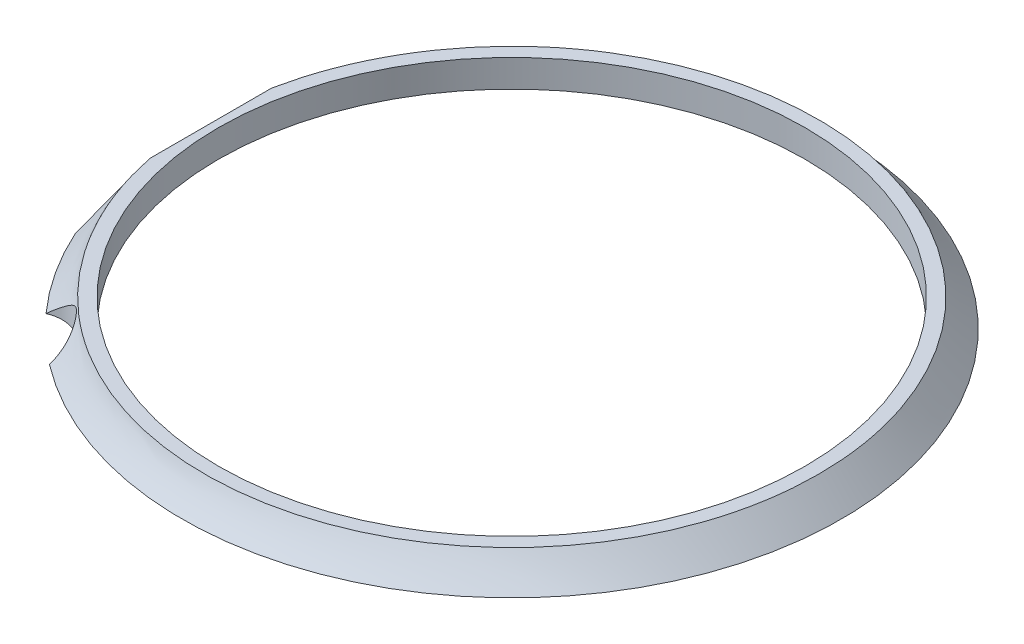
ISO-10303-21;
HEADER;
FILE_DESCRIPTION(('STEP AP214'),'2;1');
FILE_NAME('part.step','',(''),(''),'','','');
FILE_SCHEMA(('AUTOMOTIVE_DESIGN { 1 0 10303 214 1 1 1 1 }'));
ENDSEC;
DATA;
#1=APPLICATION_CONTEXT('core data for automotive mechanical design processes');
#2=APPLICATION_PROTOCOL_DEFINITION('international standard','automotive_design',2000,#1);
#3=PRODUCT_CONTEXT('',#1,'mechanical');
#4=PRODUCT('Part','Part','',(#3));
#5=PRODUCT_RELATED_PRODUCT_CATEGORY('part','',(#4));
#6=PRODUCT_DEFINITION_FORMATION('','',#4);
#7=PRODUCT_DEFINITION_CONTEXT('part definition',#1,'design');
#8=PRODUCT_DEFINITION('design','',#6,#7);
#9=PRODUCT_DEFINITION_SHAPE('','',#8);
#10=(LENGTH_UNIT() NAMED_UNIT(*) SI_UNIT(.MILLI.,.METRE.));
#11=(NAMED_UNIT(*) PLANE_ANGLE_UNIT() SI_UNIT($,.RADIAN.));
#12=(NAMED_UNIT(*) SI_UNIT($,.STERADIAN.) SOLID_ANGLE_UNIT());
#13=UNCERTAINTY_MEASURE_WITH_UNIT(LENGTH_MEASURE(1.E-05),#10,'distance_accuracy_value','');
#14=(GEOMETRIC_REPRESENTATION_CONTEXT(3) GLOBAL_UNCERTAINTY_ASSIGNED_CONTEXT((#13)) GLOBAL_UNIT_ASSIGNED_CONTEXT((#10,
#11,#12)) REPRESENTATION_CONTEXT('',''));
#15=CARTESIAN_POINT('',(0.,0.,0.));
#16=DIRECTION('',(0.,0.,1.));
#17=DIRECTION('',(1.,0.,0.));
#18=AXIS2_PLACEMENT_3D('',#15,#16,#17);
#19=CARTESIAN_POINT('',(-41.8249999995088,0.,18.7780931950262));
#20=CARTESIAN_POINT('',(-41.8249999995088,3.81,8.45984391351797));
#21=CARTESIAN_POINT('',(-15.9429608577891,0.,76.4259212171197));
#22=CARTESIAN_POINT('',(-27.7865568512575,3.81,77.8651297167816));
#23=CARTESIAN_POINT('',(45.847,0.,63.1913920229519));
#24=CARTESIAN_POINT('',(42.672,3.81,70.8108154412826));
#25=CARTESIAN_POINT('',(45.847,0.,-63.1913920229519));
#26=CARTESIAN_POINT('',(42.672,3.81,-70.8108154412826));
#27=CARTESIAN_POINT('',(-15.9429608577891,0.,-76.4259212171198));
#28=CARTESIAN_POINT('',(-27.7865568512574,3.81,-77.8651297167816));
#29=CARTESIAN_POINT('',(-41.8249999995088,0.,-18.7780931950262));
#30=CARTESIAN_POINT('',(-41.8249999995088,3.81,-8.45984391351802));
#31=(BOUNDED_SURFACE() B_SPLINE_SURFACE(3,1,((#19,#20),(#21,#22),(#23,#24),(#25,#26),(#27,#28),
(#29,#30)),.UNSPECIFIED.,.F.,.F.,.F.) B_SPLINE_SURFACE_WITH_KNOTS((4,2,4),(2,2),(0.,0.5,1.),(0.,
1.),.UNSPECIFIED.) GEOMETRIC_REPRESENTATION_ITEM() RATIONAL_B_SPLINE_SURFACE(((1.,1.),
(0.22368840777683,0.159798457629938),(0.105795018124039,0.0638791126665803),(0.105795018124039,
0.0638791126665803),(0.22368840777683,0.159798457629938),(1.,1.))) REPRESENTATION_ITEM('') SURFACE());
#32=CARTESIAN_POINT('',(0.,0.,0.));
#33=DIRECTION('',(0.,1.,0.));
#34=DIRECTION('',(0.,0.,1.));
#35=AXIS2_PLACEMENT_3D('',#32,#33,#34);
#36=CIRCLE('',#35,45.847);
#37=CARTESIAN_POINT('',(-41.8249999995088,0.,18.7780931950262));
#38=VERTEX_POINT('',#37);
#39=CARTESIAN_POINT('',(-34.1756288872835,1.3317228245493E-13,30.5609849180038));
#40=VERTEX_POINT('',#39);
#41=EDGE_CURVE('E104',#38,#40,#36,.T.);
#42=CARTESIAN_POINT('',(-34.1756288872835,4.78382521952232E-12,30.5609849180038));
#43=CARTESIAN_POINT('',(-34.0790516877042,0.0824546529163062,30.5194759500783));
#44=CARTESIAN_POINT('',(-33.9811988656631,0.165049547194292,30.4812178664513));
#45=CARTESIAN_POINT('',(-33.7832628001081,0.330405720716436,30.4112914406965));
#46=CARTESIAN_POINT('',(-33.6831790527442,0.413167033626343,30.3796246042296));
#47=CARTESIAN_POINT('',(-33.4811349348423,0.578713547170543,30.3229844774318));
#48=CARTESIAN_POINT('',(-33.3791743535553,0.661498749447283,30.298011943762));
#49=CARTESIAN_POINT('',(-33.1729364269723,0.8275803363406,30.2546906722965));
#50=CARTESIAN_POINT('',(-33.0686472971881,0.910875758263926,30.2363943307135));
#51=CARTESIAN_POINT('',(-32.8588686000301,1.07717809116038,30.2067899687014));
#52=CARTESIAN_POINT('',(-32.7533791537151,1.16018503014545,30.1954812497822));
#53=CARTESIAN_POINT('',(-32.5415418044431,1.32572471170788,30.1799439099838));
#54=CARTESIAN_POINT('',(-32.4351940307537,1.40825752260027,30.1757142422511));
#55=CARTESIAN_POINT('',(-32.1838532712099,1.60201619305894,30.1742030489647));
#56=CARTESIAN_POINT('',(-32.0386173557935,1.71296715727747,30.1799409417553));
#57=CARTESIAN_POINT('',(-31.7478109539478,1.93295371792707,30.2049344329739));
#58=CARTESIAN_POINT('',(-31.6022403950101,2.04198884398452,30.2241933048001));
#59=CARTESIAN_POINT('',(-31.3118823489997,2.25668156594579,30.2765663387532));
#60=CARTESIAN_POINT('',(-31.1670939550443,2.36235014514909,30.3096290862594));
#61=CARTESIAN_POINT('',(-30.9504405327218,2.51718118055771,30.3701215173245));
#62=CARTESIAN_POINT('',(-30.87832597975,2.56816925091541,30.3920962989179));
#63=CARTESIAN_POINT('',(-30.7342569872871,2.66857135573627,30.4398218805117));
#64=CARTESIAN_POINT('',(-30.6623025216772,2.71798566764545,30.4655720104008));
#65=CARTESIAN_POINT('',(-30.5302881122611,2.80684662294673,30.5164985234848));
#66=CARTESIAN_POINT('',(-30.4702067695359,2.84660210387898,30.5410804560938));
#67=CARTESIAN_POINT('',(-30.3501294187899,2.924276705525,30.5931530087955));
#68=CARTESIAN_POINT('',(-30.2901333971589,2.96219616113305,30.6206430955));
#69=CARTESIAN_POINT('',(-30.1701284438456,3.0357226247667,30.6787426358889));
#70=CARTESIAN_POINT('',(-30.1101195478741,3.07132755286394,30.7093548334731));
#71=CARTESIAN_POINT('',(-29.9901554926618,3.13946660637709,30.7738714572537));
#72=CARTESIAN_POINT('',(-29.9302003292669,3.17200099396896,30.807775601867));
#73=CARTESIAN_POINT('',(-29.7690753520476,3.25412468076235,30.9036988171271));
#74=CARTESIAN_POINT('',(-29.6678769235556,3.30008295669539,30.9690361292844));
#75=CARTESIAN_POINT('',(-29.5171193004197,3.35586827544754,31.0750731654993));
#76=CARTESIAN_POINT('',(-29.4671034304848,3.37225876523768,31.1117053719498));
#77=CARTESIAN_POINT('',(-29.3676510162733,3.39982809815378,31.1876437236439));
#78=CARTESIAN_POINT('',(-29.31821427987,3.41100872029103,31.2269489508709));
#79=CARTESIAN_POINT('',(-29.2288082781275,3.42601344077296,31.301032427126));
#80=CARTESIAN_POINT('',(-29.1886751026885,3.43077300335648,31.3354241753082));
#81=CARTESIAN_POINT('',(-29.1094277980812,3.43597073456687,31.4056760665071));
#82=CARTESIAN_POINT('',(-29.0703135355323,3.43640947167423,31.4415360157327));
#83=CARTESIAN_POINT('',(-28.9934066064559,3.43292727079906,31.5144522732109));
#84=CARTESIAN_POINT('',(-28.9556141724136,3.42900556983361,31.5515087897353));
#85=CARTESIAN_POINT('',(-28.8816134884635,3.41699294299171,31.6265161793839));
#86=CARTESIAN_POINT('',(-28.8454055104814,3.40890130448781,31.6644672043183));
#87=CARTESIAN_POINT('',(-28.7640420253439,3.38588292622182,31.7525900340755));
#88=CARTESIAN_POINT('',(-28.7194991596746,3.36962810670546,31.8029808838595));
#89=CARTESIAN_POINT('',(-28.6335272005109,3.33168863558407,31.9044067577392));
#90=CARTESIAN_POINT('',(-28.5921010072358,3.30999900592839,31.9554423314529));
#91=CARTESIAN_POINT('',(-28.5121946291211,3.2621730103,32.058059228101));
#92=CARTESIAN_POINT('',(-28.4737261062896,3.23602023209365,32.1096418814996));
#93=CARTESIAN_POINT('',(-28.3997680653215,3.18026120304879,32.2130269548802));
#94=CARTESIAN_POINT('',(-28.3642778944715,3.15065571229755,32.2648293240828));
#95=CARTESIAN_POINT('',(-28.264158633257,3.05979815731606,32.4172085125385));
#96=CARTESIAN_POINT('',(-28.2033276344961,2.99484897490993,32.5180810861097));
#97=CARTESIAN_POINT('',(-28.0908339065977,2.85866592162234,32.7207061831737));
#98=CARTESIAN_POINT('',(-28.039179496807,2.78742643474479,32.8224594183165));
#99=CARTESIAN_POINT('',(-27.9441870330087,2.6408193237885,33.0270616325258));
#100=CARTESIAN_POINT('',(-27.9008591209809,2.56544680729623,33.1299117888239));
#101=CARTESIAN_POINT('',(-27.8220680143391,2.41202543756798,33.3366358231647));
#102=CARTESIAN_POINT('',(-27.786606932381,2.3339758718859,33.4405099683987));
#103=CARTESIAN_POINT('',(-27.7060088432312,2.13321218024965,33.7059352370803));
#104=CARTESIAN_POINT('',(-27.6660822948473,2.00927030441305,33.8681609020256));
#105=CARTESIAN_POINT('',(-27.60359565078,1.75918151220183,34.1943320080754));
#106=CARTESIAN_POINT('',(-27.581044727405,1.63303346710888,34.3582783112566));
#107=CARTESIAN_POINT('',(-27.553128218866,1.37995763716617,34.6866382286432));
#108=CARTESIAN_POINT('',(-27.5477369915352,1.25303130000438,34.8510507777673));
#109=CARTESIAN_POINT('',(-27.5539780828322,0.999025205137314,35.1794326896382));
#110=CARTESIAN_POINT('',(-27.5656105398483,0.871945446193235,35.3434020487715));
#111=CARTESIAN_POINT('',(-27.6055613274528,0.620053344948124,35.6672644003016));
#112=CARTESIAN_POINT('',(-27.6336383006751,0.49523459496259,35.8271821412167));
#113=CARTESIAN_POINT('',(-27.7061304488373,0.246720512001005,36.1436688661883));
#114=CARTESIAN_POINT('',(-27.7505155548785,0.12302353810021,36.3002434556857));
#115=CARTESIAN_POINT('',(-27.8030299376046,0.,36.454614732413));
#116=B_SPLINE_CURVE_WITH_KNOTS('',3,(#42,#43,#44,#45,#46,#47,#48,#49,#50,#51,#52,#53,#54,#55,
#56,#57,#58,#59,#60,#61,#62,#63,#64,#65,#66,#67,#68,#69,#70,#71,#72,#73,#74,#75,#76,#77,#78,#79,
#80,#81,#82,#83,#84,#85,#86,#87,#88,#89,#90,#91,#92,#93,#94,#95,#96,#97,#98,#99,#100,#101,#102,
#103,#104,#105,#106,#107,#108,#109,#110,#111,#112,#113,#114,#115),.UNSPECIFIED.,.F.,.F.,(4,2,2,
2,2,2,2,2,2,2,2,2,2,2,2,2,2,2,2,2,2,2,2,2,2,2,2,2,2,2,2,2,2,2,2,2,4),(0.,0.400752067362811,
0.801595579642889,1.20248438041773,1.60645501177636,2.01038525527044,2.41425576008042,
2.96230255175026,3.51048207007455,4.05663777330799,4.32960122335883,4.60251628185416,
4.830813232307,5.05906838289588,5.28752589542609,5.51596388358928,5.90127698864556,
6.09344240598417,6.28554215650701,6.44455092863526,6.60353878008675,6.76255445537255,
6.92159731488568,7.12882434139867,7.33624187721116,7.54443926152934,7.75259089905345,
8.1554570199123,8.55868652927859,8.96240411650971,9.3662299921632,9.989456817406,
10.6130124089316,11.2356357670651,11.8582641866259,12.4719754595566,13.0845608053353),.UNSPECIFIED.);
#117=CARTESIAN_POINT('',(-27.8030299376114,0.,36.4546147324078));
#118=VERTEX_POINT('',#117);
#119=EDGE_CURVE('E11',#40,#118,#116,.T.);
#120=CARTESIAN_POINT('',(-27.8030299376099,1.33172282454928E-13,-36.4546147324059));
#121=VERTEX_POINT('',#120);
#122=EDGE_CURVE('E97',#118,#121,#36,.T.);
#123=CARTESIAN_POINT('',(-27.8030299376099,4.50376339441429E-12,-36.4546147324059));
#124=CARTESIAN_POINT('',(-27.7687467823755,0.0803296739678253,-36.353829428577));
#125=CARTESIAN_POINT('',(-27.7379243110401,0.160941931389481,-36.2520969173375));
#126=CARTESIAN_POINT('',(-27.6832304691349,0.322615444406957,-36.0471224377738));
#127=CARTESIAN_POINT('',(-27.6593594244016,0.403676720868381,-35.9438803989311));
#128=CARTESIAN_POINT('',(-27.618600156033,0.566129461167152,-35.7362750672095));
#129=CARTESIAN_POINT('',(-27.6017123545856,0.647520944667622,-35.6319117069297));
#130=CARTESIAN_POINT('',(-27.5747659516491,0.811556507141978,-35.4210759883172));
#131=CARTESIAN_POINT('',(-27.5647990853103,0.894203102619583,-35.3145938588799));
#132=CARTESIAN_POINT('',(-27.5520680736961,1.059531600838,-35.1012353206684));
#133=CARTESIAN_POINT('',(-27.5493035912117,1.14221350174457,-34.9943589305877));
#134=CARTESIAN_POINT('',(-27.5509928891297,1.30741915067271,-34.7805618555216));
#135=CARTESIAN_POINT('',(-27.5554458066548,1.38994291641924,-34.6736411773588));
#136=CARTESIAN_POINT('',(-27.5720220704635,1.55896152776035,-34.4544141487491));
#137=CARTESIAN_POINT('',(-27.5845379773484,1.64543599913601,-34.3421214928543));
#138=CARTESIAN_POINT('',(-27.6176626444916,1.81763580958423,-34.118116730928));
#139=CARTESIAN_POINT('',(-27.6382730986788,1.9033609880128,-34.0064047513746));
#140=CARTESIAN_POINT('',(-27.6877212793598,2.07363367849421,-33.7837591195434));
#141=CARTESIAN_POINT('',(-27.7165654192739,2.15818021842181,-33.6728261433363));
#142=CARTESIAN_POINT('',(-27.782499998266,2.32487022610439,-33.4526318437122));
#143=CARTESIAN_POINT('',(-27.8195429808314,2.40702456284356,-33.343364619444));
#144=CARTESIAN_POINT('',(-27.9023037312351,2.56834284317102,-33.1260190545079));
#145=CARTESIAN_POINT('',(-27.9480159181911,2.64750867154077,-33.0179399960452));
#146=CARTESIAN_POINT('',(-28.0486868528748,2.8012080961087,-32.8029804029682));
#147=CARTESIAN_POINT('',(-28.103632039419,2.87574826961305,-32.6960983523028));
#148=CARTESIAN_POINT('',(-28.193164983893,2.98138646268919,-32.537522786491));
#149=CARTESIAN_POINT('',(-28.223854793788,3.01526213028256,-32.4854665394211));
#150=CARTESIAN_POINT('',(-28.2878715298897,3.0807669952808,-32.3815541045416));
#151=CARTESIAN_POINT('',(-28.3211983403864,3.11239629113965,-32.3296979080586));
#152=CARTESIAN_POINT('',(-28.3906443231824,3.17276894197532,-32.2262257752145));
#153=CARTESIAN_POINT('',(-28.4267612243719,3.20151460129328,-32.1746096789565));
#154=CARTESIAN_POINT('',(-28.501962023801,3.2553487651953,-32.0716595102314));
#155=CARTESIAN_POINT('',(-28.5410454519637,3.28043784736966,-32.0203253944584));
#156=CARTESIAN_POINT('',(-28.6477839143823,3.34022802331255,-31.8860660174121));
#157=CARTESIAN_POINT('',(-28.7180572988829,3.37116632362161,-31.8034035884194));
#158=CARTESIAN_POINT('',(-28.8293454197878,3.40493775174718,-31.6815187132792));
#159=CARTESIAN_POINT('',(-28.8673832248822,3.41408624990685,-31.6412781487722));
#160=CARTESIAN_POINT('',(-28.9452665112728,3.42775928861925,-31.561751440322));
#161=CARTESIAN_POINT('',(-28.9851118633616,3.43228415913688,-31.522465228467));
#162=CARTESIAN_POINT('',(-29.0665249936773,3.43646914779562,-31.4449995178995));
#163=CARTESIAN_POINT('',(-29.1081009073009,3.43610287883115,-31.4068271365055));
#164=CARTESIAN_POINT('',(-29.1923991601175,3.43048230488662,-31.3321487791143));
#165=CARTESIAN_POINT('',(-29.235121536427,3.42522784146683,-31.2956428571718));
#166=CARTESIAN_POINT('',(-29.3214298723357,3.41013100592703,-31.2244797058149));
#167=CARTESIAN_POINT('',(-29.3650174588772,3.40027901020345,-31.1898265249813));
#168=CARTESIAN_POINT('',(-29.4526745394879,3.37648869794448,-31.1225810958056));
#169=CARTESIAN_POINT('',(-29.4967442320248,3.36254863247344,-31.0899897368107));
#170=CARTESIAN_POINT('',(-29.6063036547645,3.3236528551073,-31.0118112293184));
#171=CARTESIAN_POINT('',(-29.6719464047248,3.29661859738827,-30.9674731967203));
#172=CARTESIAN_POINT('',(-29.8034121771341,3.23670695517885,-30.8832481728738));
#173=CARTESIAN_POINT('',(-29.8692352869577,3.20382590877612,-30.8433639967633));
#174=CARTESIAN_POINT('',(-30.0011201167315,3.13359885800592,-30.7676504752641));
#175=CARTESIAN_POINT('',(-30.0671819615937,3.09623979552824,-30.7318336122444));
#176=CARTESIAN_POINT('',(-30.1993688329343,3.01823153760124,-30.6640756940901));
#177=CARTESIAN_POINT('',(-30.2654938739361,2.97758108353412,-30.6321361334036));
#178=CARTESIAN_POINT('',(-30.3965292459983,2.89462548019347,-30.5724731082852));
#179=CARTESIAN_POINT('',(-30.4614381114195,2.85236807484449,-30.544679556631));
#180=CARTESIAN_POINT('',(-30.5913671145861,2.76601807450166,-30.4923834177217));
#181=CARTESIAN_POINT('',(-30.6563872701676,2.72192515240131,-30.46788142037));
#182=CARTESIAN_POINT('',(-30.8517182967234,2.58747487431465,-30.3990548374002));
#183=CARTESIAN_POINT('',(-30.9822407178826,2.49498421332836,-30.3594362513989));
#184=CARTESIAN_POINT('',(-31.2437330253332,2.30647734872086,-30.291951418864));
#185=CARTESIAN_POINT('',(-31.3747029565831,2.21046078082918,-30.2640863903549));
#186=CARTESIAN_POINT('',(-31.6368283806868,2.01608198940844,-30.2196312447695));
#187=CARTESIAN_POINT('',(-31.7679838947019,1.91771947398036,-30.2030425384272));
#188=CARTESIAN_POINT('',(-32.0401248488646,1.71179762061938,-30.1799889879246));
#189=CARTESIAN_POINT('',(-32.1810905400286,1.60411276344494,-30.1744008509286));
#190=CARTESIAN_POINT('',(-32.4620489366487,1.38758652223469,-30.1756715793049));
#191=CARTESIAN_POINT('',(-32.6020414480718,1.2787449179198,-30.182532859223));
#192=CARTESIAN_POINT('',(-33.0190802166047,0.951506518537877,-30.2214591476529));
#193=CARTESIAN_POINT('',(-33.2938156588769,0.73192114713069,-30.2718158112191));
#194=CARTESIAN_POINT('',(-33.666403541452,0.427004926923235,-30.3744652979919));
#195=CARTESIAN_POINT('',(-33.7699818727807,0.341438988184464,-30.4068619030874));
#196=CARTESIAN_POINT('',(-33.9746872693336,0.170545287052974,-30.4786797444817));
#197=CARTESIAN_POINT('',(-34.0758166724699,0.0852173723434672,-30.5180939546282));
#198=CARTESIAN_POINT('',(-34.1756288872792,0.,-30.5609849180121));
#199=B_SPLINE_CURVE_WITH_KNOTS('',3,(#123,#124,#125,#126,#127,#128,#129,#130,#131,#132,#133,
#134,#135,#136,#137,#138,#139,#140,#141,#142,#143,#144,#145,#146,#147,#148,#149,#150,#151,#152,
#153,#154,#155,#156,#157,#158,#159,#160,#161,#162,#163,#164,#165,#166,#167,#168,#169,#170,#171,
#172,#173,#174,#175,#176,#177,#178,#179,#180,#181,#182,#183,#184,#185,#186,#187,#188,#189,#190,
#191,#192,#193,#194,#195,#196,#197,#198),.UNSPECIFIED.,.F.,.F.,(4,2,2,2,2,2,2,2,2,2,2,2,2,2,2,2,
2,2,2,2,2,2,2,2,2,2,2,2,2,2,2,2,2,2,2,2,2,4),(0.,0.400037487702402,0.800093723484121,
1.20017414205353,1.60546119360921,2.01072926966133,2.41594889740762,2.84256276993799,
3.26926596667737,3.69630244424495,4.12092894824972,4.54528301717541,4.96901916848057,
5.17678063239346,5.38453298491021,5.59211797548022,5.79967014045234,6.13665449588286,
6.30483569630858,6.47300489365518,6.64208170831743,6.81116400341157,6.98060182191266,
7.15011223438532,7.40078375876898,7.65161283823319,7.90319200511049,8.15486783358446,
8.40163442744832,8.64844518731605,9.1422914328792,9.63618884330108,10.1301480318129,
10.6620959173342,11.1941469843806,12.2559014719991,12.6703637065277,13.0844132839124),.UNSPECIFIED.);
#200=CARTESIAN_POINT('',(-34.1756288872853,0.,-30.5609849180053));
#201=VERTEX_POINT('',#200);
#202=EDGE_CURVE('E58',#121,#201,#199,.T.);
#203=CARTESIAN_POINT('',(-41.8249999995088,0.,-18.7780931950262));
#204=VERTEX_POINT('',#203);
#205=EDGE_CURVE('E99',#201,#204,#36,.T.);
#206=DIRECTION('',(0.,0.346388874667865,0.938091012379039));
#207=VECTOR('',#206,1.);
#208=CARTESIAN_POINT('',(-41.8249999995088,0.,-18.7780931950262));
#209=LINE('',#208,#207);
#210=CARTESIAN_POINT('',(-41.8249999995088,3.81,-8.45984391351796));
#211=VERTEX_POINT('',#210);
#212=EDGE_CURVE('E118',#204,#211,#209,.T.);
#213=CARTESIAN_POINT('',(0.,3.81,0.));
#214=DIRECTION('',(0.,1.,0.));
#215=DIRECTION('',(0.,0.,1.));
#216=AXIS2_PLACEMENT_3D('',#213,#214,#215);
#217=CIRCLE('',#216,42.672);
#218=CARTESIAN_POINT('',(-41.8249999995088,3.81,8.45984391351799));
#219=VERTEX_POINT('',#218);
#220=EDGE_CURVE('E121',#219,#211,#217,.T.);
#221=DIRECTION('',(0.,0.346388874667865,-0.938091012379039));
#222=VECTOR('',#221,1.);
#223=CARTESIAN_POINT('',(-41.8249999995088,0.,18.7780931950262));
#224=LINE('',#223,#222);
#225=EDGE_CURVE('E117',#38,#219,#224,.T.);
#226=ORIENTED_EDGE('',*,*,#41,.T.);
#227=ORIENTED_EDGE('',*,*,#119,.T.);
#228=ORIENTED_EDGE('',*,*,#122,.T.);
#229=ORIENTED_EDGE('',*,*,#202,.T.);
#230=ORIENTED_EDGE('',*,*,#205,.T.);
#231=ORIENTED_EDGE('',*,*,#212,.T.);
#232=ORIENTED_EDGE('',*,*,#220,.F.);
#233=ORIENTED_EDGE('',*,*,#225,.F.);
#234=EDGE_LOOP('',(#226,#227,#228,#229,#230,#231,#232,#233));
#235=FACE_BOUND('',#234,.T.);
#236=ADVANCED_FACE('F44',(#235),#31,.T.);
#237=CARTESIAN_POINT('',(0.,3.81,0.));
#238=DIRECTION('',(0.,1.,0.));
#239=DIRECTION('',(0.,0.,1.));
#240=AXIS2_PLACEMENT_3D('',#237,#238,#239);
#241=PLANE('',#240);
#242=CARTESIAN_POINT('',(0.,3.81,0.));
#243=DIRECTION('',(0.,1.,0.));
#244=DIRECTION('',(0.,0.,1.));
#245=AXIS2_PLACEMENT_3D('',#242,#243,#244);
#246=CIRCLE('',#245,40.767);
#247=CARTESIAN_POINT('',(0.,3.81,40.767));
#248=VERTEX_POINT('',#247);
#249=EDGE_CURVE('E112',#248,#248,#246,.T.);
#250=ORIENTED_EDGE('',*,*,#249,.F.);
#251=EDGE_LOOP('',(#250));
#252=FACE_BOUND('',#251,.T.);
#253=ORIENTED_EDGE('',*,*,#220,.T.);
#254=DIRECTION('',(0.,0.,1.));
#255=VECTOR('',#254,1.);
#256=CARTESIAN_POINT('',(-41.8249999995088,3.81,-8.45984391351796));
#257=LINE('',#256,#255);
#258=EDGE_CURVE('E92',#211,#219,#257,.T.);
#259=ORIENTED_EDGE('',*,*,#258,.T.);
#260=EDGE_LOOP('',(#253,#259));
#261=FACE_BOUND('',#260,.T.);
#262=ADVANCED_FACE('F46',(#252,#261),#241,.T.);
#263=CARTESIAN_POINT('',(0.,0.,0.));
#264=DIRECTION('',(0.,1.,0.));
#265=DIRECTION('',(0.,0.,1.));
#266=AXIS2_PLACEMENT_3D('',#263,#264,#265);
#267=PLANE('',#266);
#268=CARTESIAN_POINT('',(-32.2999999995088,0.,34.9249872410262));
#269=DIRECTION('',(0.,1.,0.));
#270=DIRECTION('',(0.,0.,1.));
#271=AXIS2_PLACEMENT_3D('',#268,#269,#270);
#272=CIRCLE('',#271,4.75);
#273=EDGE_CURVE('E71',#118,#40,#272,.T.);
#274=ORIENTED_EDGE('',*,*,#273,.T.);
#275=ORIENTED_EDGE('',*,*,#41,.F.);
#276=DIRECTION('',(0.,0.,1.));
#277=VECTOR('',#276,1.);
#278=CARTESIAN_POINT('',(-41.8249999995088,0.,18.7780931950262));
#279=LINE('',#278,#277);
#280=EDGE_CURVE('E108',#204,#38,#279,.T.);
#281=ORIENTED_EDGE('',*,*,#280,.F.);
#282=ORIENTED_EDGE('',*,*,#205,.F.);
#283=CARTESIAN_POINT('',(-32.2999999995088,0.,-34.9249872410262));
#284=DIRECTION('',(0.,1.,0.));
#285=DIRECTION('',(0.,0.,-1.));
#286=AXIS2_PLACEMENT_3D('',#283,#284,#285);
#287=CIRCLE('',#286,4.75000000000001);
#288=EDGE_CURVE('E64',#201,#121,#287,.T.);
#289=ORIENTED_EDGE('',*,*,#288,.T.);
#290=ORIENTED_EDGE('',*,*,#122,.F.);
#291=EDGE_LOOP('',(#274,#275,#281,#282,#289,#290));
#292=FACE_BOUND('',#291,.T.);
#293=CARTESIAN_POINT('',(0.,0.,0.));
#294=DIRECTION('',(0.,1.,0.));
#295=DIRECTION('',(0.,0.,1.));
#296=AXIS2_PLACEMENT_3D('',#293,#294,#295);
#297=CIRCLE('',#296,40.767);
#298=CARTESIAN_POINT('',(0.,0.,40.767));
#299=VERTEX_POINT('',#298);
#300=EDGE_CURVE('E109',#299,#299,#297,.T.);
#301=ORIENTED_EDGE('',*,*,#300,.T.);
#302=EDGE_LOOP('',(#301));
#303=FACE_BOUND('',#302,.T.);
#304=ADVANCED_FACE('F95',(#292,#303),#267,.F.);
#305=CARTESIAN_POINT('',(-41.8249999995088,0.,0.));
#306=DIRECTION('',(1.,0.,0.));
#307=DIRECTION('',(0.,0.,-1.));
#308=AXIS2_PLACEMENT_3D('',#305,#306,#307);
#309=PLANE('',#308);
#310=ORIENTED_EDGE('',*,*,#225,.T.);
#311=ORIENTED_EDGE('',*,*,#258,.F.);
#312=ORIENTED_EDGE('',*,*,#212,.F.);
#313=ORIENTED_EDGE('',*,*,#280,.T.);
#314=EDGE_LOOP('',(#310,#311,#312,#313));
#315=FACE_BOUND('',#314,.T.);
#316=ADVANCED_FACE('F146',(#315),#309,.F.);
#317=CARTESIAN_POINT('',(0.,0.,0.));
#318=DIRECTION('',(0.,1.,0.));
#319=DIRECTION('',(0.,0.,1.));
#320=AXIS2_PLACEMENT_3D('',#317,#318,#319);
#321=CYLINDRICAL_SURFACE('',#320,40.767);
#322=CARTESIAN_POINT('',(0.,0.,40.767));
#323=CARTESIAN_POINT('',(0.,0.0396874999999999,40.767));
#324=CARTESIAN_POINT('',(0.,0.079375,40.767));
#325=CARTESIAN_POINT('',(0.,0.15875,40.767));
#326=CARTESIAN_POINT('',(0.,0.1984375,40.767));
#327=CARTESIAN_POINT('',(0.,0.2778125,40.767));
#328=CARTESIAN_POINT('',(0.,0.3175,40.767));
#329=CARTESIAN_POINT('',(0.,0.396875,40.767));
#330=CARTESIAN_POINT('',(0.,0.4365625,40.767));
#331=CARTESIAN_POINT('',(0.,0.5159375,40.767));
#332=CARTESIAN_POINT('',(0.,0.555625,40.767));
#333=CARTESIAN_POINT('',(0.,0.635,40.767));
#334=CARTESIAN_POINT('',(0.,0.6746875,40.767));
#335=CARTESIAN_POINT('',(0.,0.7540625,40.767));
#336=CARTESIAN_POINT('',(0.,0.79375,40.767));
#337=CARTESIAN_POINT('',(0.,0.873125,40.767));
#338=CARTESIAN_POINT('',(0.,0.9128125,40.767));
#339=CARTESIAN_POINT('',(0.,0.9921875,40.767));
#340=CARTESIAN_POINT('',(0.,1.031875,40.767));
#341=CARTESIAN_POINT('',(0.,1.11125,40.767));
#342=CARTESIAN_POINT('',(0.,1.1509375,40.767));
#343=CARTESIAN_POINT('',(0.,1.2303125,40.767));
#344=CARTESIAN_POINT('',(0.,1.27,40.767));
#345=CARTESIAN_POINT('',(0.,1.349375,40.767));
#346=CARTESIAN_POINT('',(0.,1.3890625,40.767));
#347=CARTESIAN_POINT('',(0.,1.4684375,40.767));
#348=CARTESIAN_POINT('',(0.,1.508125,40.767));
#349=CARTESIAN_POINT('',(0.,1.5875,40.767));
#350=CARTESIAN_POINT('',(0.,1.6271875,40.767));
#351=CARTESIAN_POINT('',(0.,1.7065625,40.767));
#352=CARTESIAN_POINT('',(0.,1.74625,40.767));
#353=CARTESIAN_POINT('',(0.,1.825625,40.767));
#354=CARTESIAN_POINT('',(0.,1.8653125,40.767));
#355=CARTESIAN_POINT('',(0.,1.9446875,40.767));
#356=CARTESIAN_POINT('',(0.,1.984375,40.767));
#357=CARTESIAN_POINT('',(0.,2.06375,40.767));
#358=CARTESIAN_POINT('',(0.,2.1034375,40.767));
#359=CARTESIAN_POINT('',(0.,2.1828125,40.767));
#360=CARTESIAN_POINT('',(0.,2.2225,40.767));
#361=CARTESIAN_POINT('',(0.,2.301875,40.767));
#362=CARTESIAN_POINT('',(0.,2.3415625,40.767));
#363=CARTESIAN_POINT('',(0.,2.4209375,40.767));
#364=CARTESIAN_POINT('',(0.,2.460625,40.767));
#365=CARTESIAN_POINT('',(0.,2.54,40.767));
#366=CARTESIAN_POINT('',(0.,2.5796875,40.767));
#367=CARTESIAN_POINT('',(0.,2.6590625,40.767));
#368=CARTESIAN_POINT('',(0.,2.69875,40.767));
#369=CARTESIAN_POINT('',(0.,2.778125,40.767));
#370=CARTESIAN_POINT('',(0.,2.8178125,40.767));
#371=CARTESIAN_POINT('',(0.,2.8971875,40.767));
#372=CARTESIAN_POINT('',(0.,2.936875,40.767));
#373=CARTESIAN_POINT('',(0.,3.01625,40.767));
#374=CARTESIAN_POINT('',(0.,3.0559375,40.767));
#375=CARTESIAN_POINT('',(0.,3.1353125,40.767));
#376=CARTESIAN_POINT('',(0.,3.175,40.767));
#377=CARTESIAN_POINT('',(0.,3.254375,40.767));
#378=CARTESIAN_POINT('',(0.,3.2940625,40.767));
#379=CARTESIAN_POINT('',(0.,3.3734375,40.767));
#380=CARTESIAN_POINT('',(0.,3.413125,40.767));
#381=CARTESIAN_POINT('',(0.,3.4925,40.767));
#382=CARTESIAN_POINT('',(0.,3.5321875,40.767));
#383=CARTESIAN_POINT('',(0.,3.6115625,40.767));
#384=CARTESIAN_POINT('',(0.,3.65125,40.767));
#385=CARTESIAN_POINT('',(0.,3.730625,40.767));
#386=CARTESIAN_POINT('',(0.,3.7703125,40.767));
#387=CARTESIAN_POINT('',(0.,3.81,40.767));
#388=B_SPLINE_CURVE_WITH_KNOTS('',3,(#322,#323,#324,#325,#326,#327,#328,#329,#330,#331,#332,
#333,#334,#335,#336,#337,#338,#339,#340,#341,#342,#343,#344,#345,#346,#347,#348,#349,#350,#351,
#352,#353,#354,#355,#356,#357,#358,#359,#360,#361,#362,#363,#364,#365,#366,#367,#368,#369,#370,
#371,#372,#373,#374,#375,#376,#377,#378,#379,#380,#381,#382,#383,#384,#385,#386,#387),
.UNSPECIFIED.,.F.,.F.,(4,2,2,2,2,2,2,2,2,2,2,2,2,2,2,2,2,2,2,2,2,2,2,2,2,2,2,2,2,2,2,2,4),(0.,
0.1190625,0.238125,0.3571875,0.47625,0.5953125,0.714375,0.8334375,0.9525,1.0715625,1.190625,
1.3096875,1.42875,1.5478125,1.666875,1.7859375,1.905,2.0240625,2.143125,2.2621875,2.38125,
2.5003125,2.619375,2.7384375,2.8575,2.9765625,3.095625,3.2146875,3.33375,3.4528125,3.571875,
3.6909375,3.81),.UNSPECIFIED.);
#389=EDGE_CURVE('BSEAM142',#299,#248,#388,.T.);
#390=ORIENTED_EDGE('',*,*,#300,.F.);
#391=ORIENTED_EDGE('',*,*,#249,.T.);
#392=ORIENTED_EDGE('',*,*,#389,.T.);
#393=ORIENTED_EDGE('',*,*,#389,.F.);
#394=EDGE_LOOP('',(#390,#392,#391,#393));
#395=FACE_BOUND('',#394,.T.);
#396=ADVANCED_FACE('F142',(#395),#321,.F.);
#397=CARTESIAN_POINT('',(-32.2999999995088,3.81,-34.9249872410262));
#398=DIRECTION('',(0.,-1.,0.));
#399=DIRECTION('',(0.,0.,-1.));
#400=AXIS2_PLACEMENT_3D('',#397,#398,#399);
#401=CYLINDRICAL_SURFACE('',#400,4.75000000000001);
#402=ORIENTED_EDGE('',*,*,#288,.F.);
#403=ORIENTED_EDGE('',*,*,#202,.F.);
#404=EDGE_LOOP('',(#402,#403));
#405=FACE_BOUND('',#404,.T.);
#406=ADVANCED_FACE('F87',(#405),#401,.F.);
#407=CARTESIAN_POINT('',(-32.2999999995088,3.81,34.9249872410262));
#408=DIRECTION('',(0.,-1.,0.));
#409=DIRECTION('',(0.,0.,-1.));
#410=AXIS2_PLACEMENT_3D('',#407,#408,#409);
#411=CYLINDRICAL_SURFACE('',#410,4.75);
#412=ORIENTED_EDGE('',*,*,#273,.F.);
#413=ORIENTED_EDGE('',*,*,#119,.F.);
#414=EDGE_LOOP('',(#412,#413));
#415=FACE_BOUND('',#414,.T.);
#416=ADVANCED_FACE('F141',(#415),#411,.F.);
#417=CLOSED_SHELL('',(#236,#262,#304,#316,#396,#406,#416));
#418=MANIFOLD_SOLID_BREP('B2',#417);
#419=ADVANCED_BREP_SHAPE_REPRESENTATION('',(#18,#418),#14);
#420=SHAPE_DEFINITION_REPRESENTATION(#9,#419);
ENDSEC;
END-ISO-10303-21;
